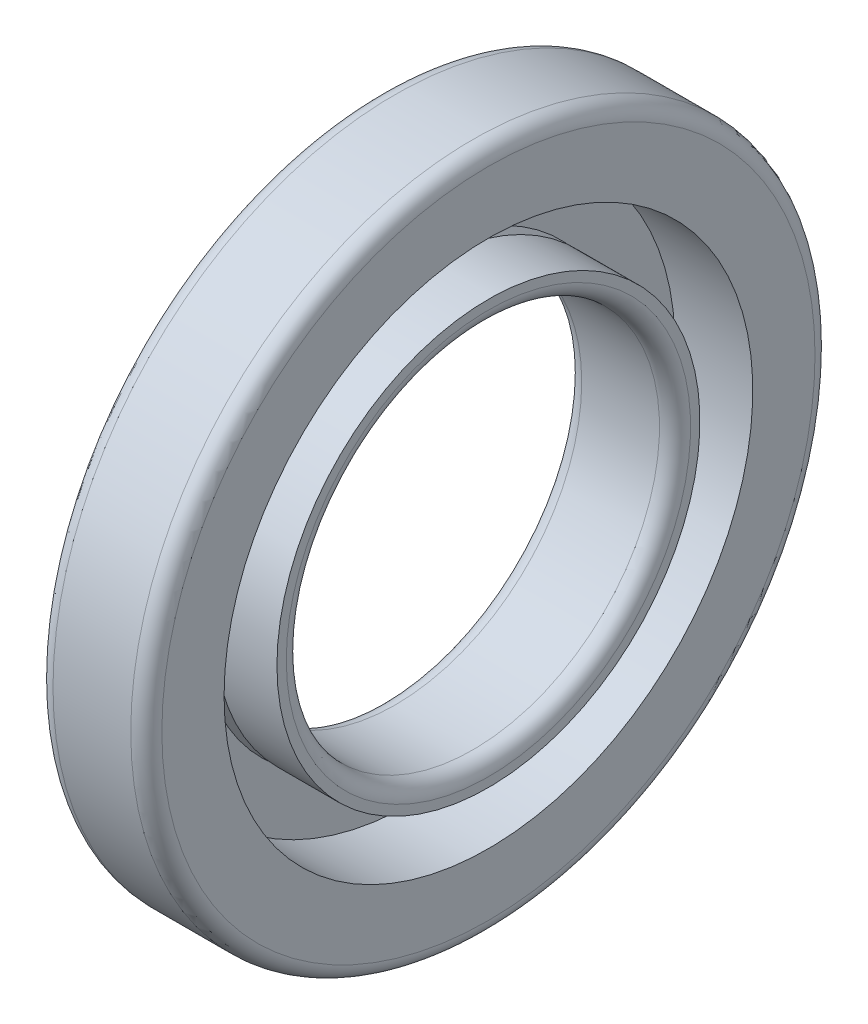
ISO-10303-21;
HEADER;
FILE_DESCRIPTION(('STEP AP214'),'2;1');
FILE_NAME('part.step','',(''),(''),'','','');
FILE_SCHEMA(('AUTOMOTIVE_DESIGN { 1 0 10303 214 1 1 1 1 }'));
ENDSEC;
DATA;
#1=APPLICATION_CONTEXT('core data for automotive mechanical design processes');
#2=APPLICATION_PROTOCOL_DEFINITION('international standard','automotive_design',2000,#1);
#3=PRODUCT_CONTEXT('',#1,'mechanical');
#4=PRODUCT('Part','Part','',(#3));
#5=PRODUCT_RELATED_PRODUCT_CATEGORY('part','',(#4));
#6=PRODUCT_DEFINITION_FORMATION('','',#4);
#7=PRODUCT_DEFINITION_CONTEXT('part definition',#1,'design');
#8=PRODUCT_DEFINITION('design','',#6,#7);
#9=PRODUCT_DEFINITION_SHAPE('','',#8);
#10=(LENGTH_UNIT() NAMED_UNIT(*) SI_UNIT(.MILLI.,.METRE.));
#11=(NAMED_UNIT(*) PLANE_ANGLE_UNIT() SI_UNIT($,.RADIAN.));
#12=(NAMED_UNIT(*) SI_UNIT($,.STERADIAN.) SOLID_ANGLE_UNIT());
#13=UNCERTAINTY_MEASURE_WITH_UNIT(LENGTH_MEASURE(1.E-05),#10,'distance_accuracy_value','');
#14=(GEOMETRIC_REPRESENTATION_CONTEXT(3) GLOBAL_UNCERTAINTY_ASSIGNED_CONTEXT((#13)) GLOBAL_UNIT_ASSIGNED_CONTEXT((#10,
#11,#12)) REPRESENTATION_CONTEXT('',''));
#15=CARTESIAN_POINT('',(0.,0.,0.));
#16=DIRECTION('',(0.,0.,1.));
#17=DIRECTION('',(1.,0.,0.));
#18=AXIS2_PLACEMENT_3D('',#15,#16,#17);
#19=CARTESIAN_POINT('',(0.,0.,0.));
#20=DIRECTION('',(-1.,0.,0.));
#21=DIRECTION('',(0.,0.,1.));
#22=AXIS2_PLACEMENT_3D('',#19,#20,#21);
#23=CYLINDRICAL_SURFACE('',#22,6.);
#24=CARTESIAN_POINT('',(0.5,0.,0.));
#25=DIRECTION('',(1.,0.,0.));
#26=DIRECTION('',(0.,0.,-1.));
#27=AXIS2_PLACEMENT_3D('',#24,#25,#26);
#28=CIRCLE('',#27,6.);
#29=CARTESIAN_POINT('',(0.5,0.,-6.));
#30=VERTEX_POINT('',#29);
#31=EDGE_CURVE('E22',#30,#30,#28,.F.);
#32=ORIENTED_EDGE('',*,*,#31,.T.);
#33=EDGE_LOOP('',(#32));
#34=FACE_BOUND('',#33,.T.);
#35=CARTESIAN_POINT('',(3.,0.,0.));
#36=DIRECTION('',(-1.,0.,0.));
#37=DIRECTION('',(0.,0.,1.));
#38=AXIS2_PLACEMENT_3D('',#35,#36,#37);
#39=CIRCLE('',#38,6.);
#40=CARTESIAN_POINT('',(3.,0.,6.));
#41=VERTEX_POINT('',#40);
#42=EDGE_CURVE('E26',#41,#41,#39,.F.);
#43=ORIENTED_EDGE('',*,*,#42,.T.);
#44=EDGE_LOOP('',(#43));
#45=FACE_BOUND('',#44,.T.);
#46=ADVANCED_FACE('F15',(#34,#45),#23,.F.);
#47=CARTESIAN_POINT('',(3.5,6.,0.));
#48=DIRECTION('',(-1.,0.,0.));
#49=DIRECTION('',(0.,0.,1.));
#50=AXIS2_PLACEMENT_3D('',#47,#48,#49);
#51=PLANE('',#50);
#52=CARTESIAN_POINT('',(3.5,0.,0.));
#53=DIRECTION('',(-1.,0.,0.));
#54=DIRECTION('',(0.,0.,1.));
#55=AXIS2_PLACEMENT_3D('',#52,#53,#54);
#56=CIRCLE('',#55,6.5);
#57=CARTESIAN_POINT('',(3.5,0.,6.5));
#58=VERTEX_POINT('',#57);
#59=EDGE_CURVE('E10',#58,#58,#56,.T.);
#60=ORIENTED_EDGE('',*,*,#59,.T.);
#61=EDGE_LOOP('',(#60));
#62=FACE_BOUND('',#61,.T.);
#63=CARTESIAN_POINT('',(3.5,0.,0.));
#64=DIRECTION('',(-1.,0.,0.));
#65=DIRECTION('',(0.,0.,1.));
#66=AXIS2_PLACEMENT_3D('',#63,#64,#65);
#67=CIRCLE('',#66,6.8);
#68=CARTESIAN_POINT('',(3.5,0.,6.8));
#69=VERTEX_POINT('',#68);
#70=EDGE_CURVE('E47',#69,#69,#67,.T.);
#71=ORIENTED_EDGE('',*,*,#70,.F.);
#72=EDGE_LOOP('',(#71));
#73=FACE_BOUND('',#72,.T.);
#74=ADVANCED_FACE('F95',(#62,#73),#51,.F.);
#75=CARTESIAN_POINT('',(0.,0.,0.));
#76=DIRECTION('',(-1.,0.,0.));
#77=DIRECTION('',(0.,0.,1.));
#78=AXIS2_PLACEMENT_3D('',#75,#76,#77);
#79=CYLINDRICAL_SURFACE('',#78,6.8);
#80=CARTESIAN_POINT('',(1.5,0.,0.));
#81=DIRECTION('',(-1.,0.,0.));
#82=DIRECTION('',(0.,0.,1.));
#83=AXIS2_PLACEMENT_3D('',#80,#81,#82);
#84=CIRCLE('',#83,6.8);
#85=CARTESIAN_POINT('',(1.5,0.,6.8));
#86=VERTEX_POINT('',#85);
#87=EDGE_CURVE('E50',#86,#86,#84,.T.);
#88=ORIENTED_EDGE('',*,*,#87,.F.);
#89=EDGE_LOOP('',(#88));
#90=FACE_BOUND('',#89,.T.);
#91=ORIENTED_EDGE('',*,*,#70,.T.);
#92=EDGE_LOOP('',(#91));
#93=FACE_BOUND('',#92,.T.);
#94=ADVANCED_FACE('F89',(#90,#93),#79,.T.);
#95=CARTESIAN_POINT('',(1.5,0.,0.));
#96=DIRECTION('',(1.,0.,0.));
#97=DIRECTION('',(0.,0.,-1.));
#98=AXIS2_PLACEMENT_3D('',#95,#96,#97);
#99=CONICAL_SURFACE('',#98,6.8,0.785398163397448);
#100=CARTESIAN_POINT('',(1.25,0.,0.));
#101=DIRECTION('',(-1.,0.,0.));
#102=DIRECTION('',(0.,0.,1.));
#103=AXIS2_PLACEMENT_3D('',#100,#101,#102);
#104=CIRCLE('',#103,6.55);
#105=CARTESIAN_POINT('',(1.25,0.,6.55));
#106=VERTEX_POINT('',#105);
#107=EDGE_CURVE('E53',#106,#106,#104,.T.);
#108=ORIENTED_EDGE('',*,*,#107,.F.);
#109=EDGE_LOOP('',(#108));
#110=FACE_BOUND('',#109,.T.);
#111=ORIENTED_EDGE('',*,*,#87,.T.);
#112=EDGE_LOOP('',(#111));
#113=FACE_BOUND('',#112,.T.);
#114=ADVANCED_FACE('F83',(#110,#113),#99,.T.);
#115=CARTESIAN_POINT('',(1.25,0.,0.));
#116=DIRECTION('',(-1.,0.,0.));
#117=DIRECTION('',(0.,0.,1.));
#118=AXIS2_PLACEMENT_3D('',#115,#116,#117);
#119=CONICAL_SURFACE('',#118,6.55,0.785398163397448);
#120=CARTESIAN_POINT('',(1.,0.,0.));
#121=DIRECTION('',(-1.,0.,0.));
#122=DIRECTION('',(0.,0.,1.));
#123=AXIS2_PLACEMENT_3D('',#120,#121,#122);
#124=CIRCLE('',#123,6.8);
#125=CARTESIAN_POINT('',(1.,0.,6.8));
#126=VERTEX_POINT('',#125);
#127=EDGE_CURVE('E56',#126,#126,#124,.T.);
#128=ORIENTED_EDGE('',*,*,#127,.F.);
#129=EDGE_LOOP('',(#128));
#130=FACE_BOUND('',#129,.T.);
#131=ORIENTED_EDGE('',*,*,#107,.T.);
#132=EDGE_LOOP('',(#131));
#133=FACE_BOUND('',#132,.T.);
#134=ADVANCED_FACE('F77',(#130,#133),#119,.T.);
#135=CARTESIAN_POINT('',(1.,6.8,0.));
#136=DIRECTION('',(-1.,0.,0.));
#137=DIRECTION('',(0.,0.,1.));
#138=AXIS2_PLACEMENT_3D('',#135,#136,#137);
#139=PLANE('',#138);
#140=CARTESIAN_POINT('',(1.,0.,0.));
#141=DIRECTION('',(-1.,0.,0.));
#142=DIRECTION('',(0.,0.,1.));
#143=AXIS2_PLACEMENT_3D('',#140,#141,#142);
#144=CIRCLE('',#143,8.5);
#145=CARTESIAN_POINT('',(1.,0.,8.5));
#146=VERTEX_POINT('',#145);
#147=EDGE_CURVE('E59',#146,#146,#144,.T.);
#148=ORIENTED_EDGE('',*,*,#147,.F.);
#149=EDGE_LOOP('',(#148));
#150=FACE_BOUND('',#149,.T.);
#151=ORIENTED_EDGE('',*,*,#127,.T.);
#152=EDGE_LOOP('',(#151));
#153=FACE_BOUND('',#152,.T.);
#154=ADVANCED_FACE('F71',(#150,#153),#139,.F.);
#155=CARTESIAN_POINT('',(0.,0.,0.));
#156=DIRECTION('',(-1.,0.,0.));
#157=DIRECTION('',(0.,0.,1.));
#158=AXIS2_PLACEMENT_3D('',#155,#156,#157);
#159=CYLINDRICAL_SURFACE('',#158,8.5);
#160=CARTESIAN_POINT('',(3.5,0.,0.));
#161=DIRECTION('',(-1.,0.,0.));
#162=DIRECTION('',(0.,0.,1.));
#163=AXIS2_PLACEMENT_3D('',#160,#161,#162);
#164=CIRCLE('',#163,8.5);
#165=CARTESIAN_POINT('',(3.5,0.,8.5));
#166=VERTEX_POINT('',#165);
#167=EDGE_CURVE('E62',#166,#166,#164,.T.);
#168=ORIENTED_EDGE('',*,*,#167,.F.);
#169=EDGE_LOOP('',(#168));
#170=FACE_BOUND('',#169,.T.);
#171=ORIENTED_EDGE('',*,*,#147,.T.);
#172=EDGE_LOOP('',(#171));
#173=FACE_BOUND('',#172,.T.);
#174=ADVANCED_FACE('F68',(#170,#173),#159,.F.);
#175=CARTESIAN_POINT('',(3.5,8.5,0.));
#176=DIRECTION('',(-1.,0.,0.));
#177=DIRECTION('',(0.,0.,1.));
#178=AXIS2_PLACEMENT_3D('',#175,#176,#177);
#179=PLANE('',#178);
#180=CARTESIAN_POINT('',(3.5,0.,0.));
#181=DIRECTION('',(-1.,0.,0.));
#182=DIRECTION('',(0.,0.,1.));
#183=AXIS2_PLACEMENT_3D('',#180,#181,#182);
#184=CIRCLE('',#183,10.5);
#185=CARTESIAN_POINT('',(3.5,0.,10.5));
#186=VERTEX_POINT('',#185);
#187=EDGE_CURVE('E38',#186,#186,#184,.F.);
#188=ORIENTED_EDGE('',*,*,#187,.T.);
#189=EDGE_LOOP('',(#188));
#190=FACE_BOUND('',#189,.T.);
#191=ORIENTED_EDGE('',*,*,#167,.T.);
#192=EDGE_LOOP('',(#191));
#193=FACE_BOUND('',#192,.T.);
#194=ADVANCED_FACE('F66',(#190,#193),#179,.F.);
#195=CARTESIAN_POINT('',(0.,0.,0.));
#196=DIRECTION('',(-1.,0.,0.));
#197=DIRECTION('',(0.,0.,1.));
#198=AXIS2_PLACEMENT_3D('',#195,#196,#197);
#199=CYLINDRICAL_SURFACE('',#198,11.);
#200=CARTESIAN_POINT('',(3.,0.,0.));
#201=DIRECTION('',(-1.,0.,0.));
#202=DIRECTION('',(0.,0.,1.));
#203=AXIS2_PLACEMENT_3D('',#200,#201,#202);
#204=CIRCLE('',#203,11.);
#205=CARTESIAN_POINT('',(3.,0.,11.));
#206=VERTEX_POINT('',#205);
#207=EDGE_CURVE('E41',#206,#206,#204,.T.);
#208=ORIENTED_EDGE('',*,*,#207,.T.);
#209=EDGE_LOOP('',(#208));
#210=FACE_BOUND('',#209,.T.);
#211=CARTESIAN_POINT('',(0.5,0.,0.));
#212=DIRECTION('',(1.,0.,0.));
#213=DIRECTION('',(0.,0.,-1.));
#214=AXIS2_PLACEMENT_3D('',#211,#212,#213);
#215=CIRCLE('',#214,11.);
#216=CARTESIAN_POINT('',(0.5,0.,-11.));
#217=VERTEX_POINT('',#216);
#218=EDGE_CURVE('E44',#217,#217,#215,.T.);
#219=ORIENTED_EDGE('',*,*,#218,.T.);
#220=EDGE_LOOP('',(#219));
#221=FACE_BOUND('',#220,.T.);
#222=ADVANCED_FACE('F128',(#210,#221),#199,.T.);
#223=CARTESIAN_POINT('',(0.,11.,0.));
#224=DIRECTION('',(1.,0.,0.));
#225=DIRECTION('',(0.,0.,-1.));
#226=AXIS2_PLACEMENT_3D('',#223,#224,#225);
#227=PLANE('',#226);
#228=CARTESIAN_POINT('',(0.,0.,0.));
#229=DIRECTION('',(1.,0.,0.));
#230=DIRECTION('',(0.,0.,-1.));
#231=AXIS2_PLACEMENT_3D('',#228,#229,#230);
#232=CIRCLE('',#231,10.5);
#233=CARTESIAN_POINT('',(0.,0.,-10.5));
#234=VERTEX_POINT('',#233);
#235=EDGE_CURVE('E30',#234,#234,#232,.F.);
#236=ORIENTED_EDGE('',*,*,#235,.T.);
#237=EDGE_LOOP('',(#236));
#238=FACE_BOUND('',#237,.T.);
#239=CARTESIAN_POINT('',(0.,0.,0.));
#240=DIRECTION('',(1.,0.,0.));
#241=DIRECTION('',(0.,0.,-1.));
#242=AXIS2_PLACEMENT_3D('',#239,#240,#241);
#243=CIRCLE('',#242,6.5);
#244=CARTESIAN_POINT('',(0.,0.,-6.5));
#245=VERTEX_POINT('',#244);
#246=EDGE_CURVE('E35',#245,#245,#243,.T.);
#247=ORIENTED_EDGE('',*,*,#246,.T.);
#248=EDGE_LOOP('',(#247));
#249=FACE_BOUND('',#248,.T.);
#250=ADVANCED_FACE('F112',(#238,#249),#227,.F.);
#251=CARTESIAN_POINT('',(3.,0.,0.));
#252=DIRECTION('',(-1.,0.,0.));
#253=DIRECTION('',(0.,0.,1.));
#254=AXIS2_PLACEMENT_3D('',#251,#252,#253);
#255=TOROIDAL_SURFACE('',#254,10.5,0.5);
#256=ORIENTED_EDGE('',*,*,#187,.F.);
#257=EDGE_LOOP('',(#256));
#258=FACE_BOUND('',#257,.T.);
#259=ORIENTED_EDGE('',*,*,#207,.F.);
#260=EDGE_LOOP('',(#259));
#261=FACE_BOUND('',#260,.T.);
#262=ADVANCED_FACE('F108',(#258,#261),#255,.T.);
#263=CARTESIAN_POINT('',(0.5,0.,0.));
#264=DIRECTION('',(1.,0.,0.));
#265=DIRECTION('',(0.,0.,-1.));
#266=AXIS2_PLACEMENT_3D('',#263,#264,#265);
#267=TOROIDAL_SURFACE('',#266,10.5,0.5);
#268=ORIENTED_EDGE('',*,*,#218,.F.);
#269=EDGE_LOOP('',(#268));
#270=FACE_BOUND('',#269,.T.);
#271=ORIENTED_EDGE('',*,*,#235,.F.);
#272=EDGE_LOOP('',(#271));
#273=FACE_BOUND('',#272,.T.);
#274=ADVANCED_FACE('F111',(#270,#273),#267,.T.);
#275=CARTESIAN_POINT('',(0.5,0.,0.));
#276=DIRECTION('',(1.,0.,0.));
#277=DIRECTION('',(0.,0.,-1.));
#278=AXIS2_PLACEMENT_3D('',#275,#276,#277);
#279=TOROIDAL_SURFACE('',#278,6.5,0.5);
#280=ORIENTED_EDGE('',*,*,#246,.F.);
#281=EDGE_LOOP('',(#280));
#282=FACE_BOUND('',#281,.T.);
#283=ORIENTED_EDGE('',*,*,#31,.F.);
#284=EDGE_LOOP('',(#283));
#285=FACE_BOUND('',#284,.T.);
#286=ADVANCED_FACE('F115',(#282,#285),#279,.T.);
#287=CARTESIAN_POINT('',(3.,0.,0.));
#288=DIRECTION('',(-1.,0.,0.));
#289=DIRECTION('',(0.,0.,1.));
#290=AXIS2_PLACEMENT_3D('',#287,#288,#289);
#291=TOROIDAL_SURFACE('',#290,6.5,0.5);
#292=ORIENTED_EDGE('',*,*,#42,.F.);
#293=EDGE_LOOP('',(#292));
#294=FACE_BOUND('',#293,.T.);
#295=ORIENTED_EDGE('',*,*,#59,.F.);
#296=EDGE_LOOP('',(#295));
#297=FACE_BOUND('',#296,.T.);
#298=ADVANCED_FACE('F17',(#294,#297),#291,.T.);
#299=CLOSED_SHELL('',(#46,#74,#94,#114,#134,#154,#174,#194,#222,#250,#262,#274,#286,#298));
#300=MANIFOLD_SOLID_BREP('B1',#299);
#301=ADVANCED_BREP_SHAPE_REPRESENTATION('',(#18,#300),#14);
#302=SHAPE_DEFINITION_REPRESENTATION(#9,#301);
ENDSEC;
END-ISO-10303-21;
